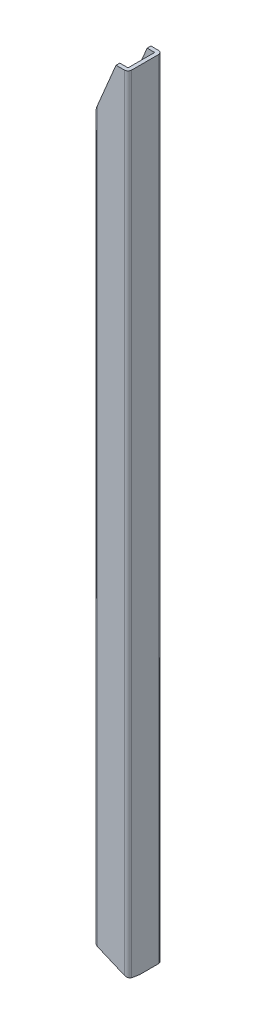
ISO-10303-21;
HEADER;
FILE_DESCRIPTION(('STEP AP214'),'2;1');
FILE_NAME('part.step','',(''),(''),'','','');
FILE_SCHEMA(('AUTOMOTIVE_DESIGN { 1 0 10303 214 1 1 1 1 }'));
ENDSEC;
DATA;
#1=APPLICATION_CONTEXT('core data for automotive mechanical design processes');
#2=APPLICATION_PROTOCOL_DEFINITION('international standard','automotive_design',2000,#1);
#3=PRODUCT_CONTEXT('',#1,'mechanical');
#4=PRODUCT('Part','Part','',(#3));
#5=PRODUCT_RELATED_PRODUCT_CATEGORY('part','',(#4));
#6=PRODUCT_DEFINITION_FORMATION('','',#4);
#7=PRODUCT_DEFINITION_CONTEXT('part definition',#1,'design');
#8=PRODUCT_DEFINITION('design','',#6,#7);
#9=PRODUCT_DEFINITION_SHAPE('','',#8);
#10=(LENGTH_UNIT() NAMED_UNIT(*) SI_UNIT(.MILLI.,.METRE.));
#11=(NAMED_UNIT(*) PLANE_ANGLE_UNIT() SI_UNIT($,.RADIAN.));
#12=(NAMED_UNIT(*) SI_UNIT($,.STERADIAN.) SOLID_ANGLE_UNIT());
#13=UNCERTAINTY_MEASURE_WITH_UNIT(LENGTH_MEASURE(1.E-05),#10,'distance_accuracy_value','');
#14=(GEOMETRIC_REPRESENTATION_CONTEXT(3) GLOBAL_UNCERTAINTY_ASSIGNED_CONTEXT((#13)) GLOBAL_UNIT_ASSIGNED_CONTEXT((#10,
#11,#12)) REPRESENTATION_CONTEXT('',''));
#15=CARTESIAN_POINT('',(0.,0.,0.));
#16=DIRECTION('',(0.,0.,1.));
#17=DIRECTION('',(1.,0.,0.));
#18=AXIS2_PLACEMENT_3D('',#15,#16,#17);
#19=CARTESIAN_POINT('',(2.80000000000002,590.8,0.));
#20=DIRECTION('',(0.,0.,1.));
#21=DIRECTION('',(1.,0.,0.));
#22=AXIS2_PLACEMENT_3D('',#19,#20,#21);
#23=PLANE('',#22);
#24=DIRECTION('',(0.92073452313586,-0.39018961788569,0.));
#25=VECTOR('',#24,1.);
#26=CARTESIAN_POINT('',(-206.971161863895,95.8007949135343,0.));
#27=LINE('',#26,#25);
#28=CARTESIAN_POINT('',(2.80000000000002,6.90380296373549,0.));
#29=VERTEX_POINT('',#28);
#30=CARTESIAN_POINT('',(19.0909760748714,0.,0.));
#31=VERTEX_POINT('',#30);
#32=EDGE_CURVE('E54',#29,#31,#27,.T.);
#33=ORIENTED_EDGE('',*,*,#32,.F.);
#34=DIRECTION('',(0.,-1.,0.));
#35=VECTOR('',#34,1.);
#36=CARTESIAN_POINT('',(2.80000000000002,590.8,0.));
#37=LINE('',#36,#35);
#38=CARTESIAN_POINT('',(2.80000000000002,556.495304558425,0.));
#39=VERTEX_POINT('',#38);
#40=EDGE_CURVE('E238',#39,#29,#37,.T.);
#41=ORIENTED_EDGE('',*,*,#40,.F.);
#42=DIRECTION('',(-0.387531836826698,-0.921856320391484,0.));
#43=VECTOR('',#42,1.);
#44=CARTESIAN_POINT('',(15.0553069286868,585.648089122031,0.));
#45=LINE('',#44,#43);
#46=CARTESIAN_POINT('',(17.2210777126401,590.8,0.));
#47=VERTEX_POINT('',#46);
#48=EDGE_CURVE('E208',#47,#39,#45,.T.);
#49=ORIENTED_EDGE('',*,*,#48,.F.);
#50=DIRECTION('',(-1.,0.,0.));
#51=VECTOR('',#50,1.);
#52=CARTESIAN_POINT('',(2.80000000000002,590.8,0.));
#53=LINE('',#52,#51);
#54=CARTESIAN_POINT('',(22.8,590.8,0.));
#55=VERTEX_POINT('',#54);
#56=EDGE_CURVE('E259',#55,#47,#53,.T.);
#57=ORIENTED_EDGE('',*,*,#56,.F.);
#58=DIRECTION('',(0.,-1.,0.));
#59=VECTOR('',#58,1.);
#60=CARTESIAN_POINT('',(22.8,590.8,0.));
#61=LINE('',#60,#59);
#62=CARTESIAN_POINT('',(22.8,0.,0.));
#63=VERTEX_POINT('',#62);
#64=EDGE_CURVE('E198',#55,#63,#61,.T.);
#65=ORIENTED_EDGE('',*,*,#64,.T.);
#66=DIRECTION('',(-1.,0.,0.));
#67=VECTOR('',#66,1.);
#68=CARTESIAN_POINT('',(2.80000000000002,0.,0.));
#69=LINE('',#68,#67);
#70=EDGE_CURVE('E41',#63,#31,#69,.T.);
#71=ORIENTED_EDGE('',*,*,#70,.T.);
#72=EDGE_LOOP('',(#33,#41,#49,#57,#65,#71));
#73=FACE_BOUND('',#72,.T.);
#74=ADVANCED_FACE('F38',(#73),#23,.F.);
#75=CARTESIAN_POINT('',(2.8,590.8,2.8));
#76=DIRECTION('',(0.,-1.,0.));
#77=DIRECTION('',(0.,0.,-1.));
#78=AXIS2_PLACEMENT_3D('',#75,#76,#77);
#79=CYLINDRICAL_SURFACE('',#78,2.8);
#80=CARTESIAN_POINT('',(2.8,7.35951557409553,2.8));
#81=DIRECTION('',(-0.385880976051716,-0.910567375927116,0.148198941354454));
#82=DIRECTION('',(0.850033983872096,-0.413360682572987,-0.326458530850899));
#83=AXIS2_PLACEMENT_3D('',#80,#81,#82);
#84=ELLIPSE('',#83,3.07500584143937,2.8);
#85=CARTESIAN_POINT('',(0.,8.54610182955487,2.80000000000002));
#86=VERTEX_POINT('',#85);
#87=EDGE_CURVE('E61',#86,#29,#84,.T.);
#88=ORIENTED_EDGE('',*,*,#87,.F.);
#89=DIRECTION('',(0.,-1.,0.));
#90=VECTOR('',#89,1.);
#91=CARTESIAN_POINT('',(0.,590.8,2.80000000000002));
#92=LINE('',#91,#90);
#93=CARTESIAN_POINT('',(0.,549.996800141644,2.80000000000002));
#94=VERTEX_POINT('',#93);
#95=EDGE_CURVE('E195',#94,#86,#92,.T.);
#96=ORIENTED_EDGE('',*,*,#95,.F.);
#97=CARTESIAN_POINT('',(2.8,556.657408256405,2.8));
#98=DIRECTION('',(-0.921624392020176,0.387434338305771,-0.0224301924871325));
#99=DIRECTION('',(-0.387319646255912,-0.921897300951451,-0.00942645864713394));
#100=AXIS2_PLACEMENT_3D('',#97,#98,#99);
#101=ELLIPSE('',#100,7.22703106865603,2.8);
#102=EDGE_CURVE('E211',#39,#94,#101,.T.);
#103=ORIENTED_EDGE('',*,*,#102,.F.);
#104=ORIENTED_EDGE('',*,*,#40,.T.);
#105=EDGE_LOOP('',(#88,#96,#103,#104));
#106=FACE_BOUND('',#105,.T.);
#107=ADVANCED_FACE('F306',(#106),#79,.T.);
#108=CARTESIAN_POINT('',(2.8,590.8,22.8));
#109=DIRECTION('',(0.,0.,1.));
#110=DIRECTION('',(1.,0.,0.));
#111=AXIS2_PLACEMENT_3D('',#108,#109,#110);
#112=PLANE('',#111);
#113=DIRECTION('',(0.92073452313586,-0.39018961788569,0.));
#114=VECTOR('',#113,1.);
#115=CARTESIAN_POINT('',(-205.63801498865,98.9466355412257,22.8));
#116=LINE('',#115,#114);
#117=CARTESIAN_POINT('',(2.8,10.6146056480961,22.8));
#118=VERTEX_POINT('',#117);
#119=CARTESIAN_POINT('',(22.8,2.13898953767221,22.8));
#120=VERTEX_POINT('',#119);
#121=EDGE_CURVE('E224',#118,#120,#116,.T.);
#122=ORIENTED_EDGE('',*,*,#121,.F.);
#123=DIRECTION('',(0.,-1.,0.));
#124=VECTOR('',#123,1.);
#125=CARTESIAN_POINT('',(2.8,590.8,22.8));
#126=LINE('',#125,#124);
#127=CARTESIAN_POINT('',(2.8,557.815291813409,22.8));
#128=VERTEX_POINT('',#127);
#129=EDGE_CURVE('E190',#128,#118,#126,.T.);
#130=ORIENTED_EDGE('',*,*,#129,.F.);
#131=DIRECTION('',(-0.387531836826698,-0.921856320391484,0.));
#132=VECTOR('',#131,1.);
#133=CARTESIAN_POINT('',(14.5837432332933,585.846326028385,22.8));
#134=LINE('',#133,#132);
#135=CARTESIAN_POINT('',(16.6661787829519,590.8,22.8));
#136=VERTEX_POINT('',#135);
#137=EDGE_CURVE('E201',#136,#128,#134,.T.);
#138=ORIENTED_EDGE('',*,*,#137,.F.);
#139=DIRECTION('',(-1.,0.,0.));
#140=VECTOR('',#139,1.);
#141=CARTESIAN_POINT('',(2.8,590.8,22.8));
#142=LINE('',#141,#140);
#143=CARTESIAN_POINT('',(22.8,590.8,22.8));
#144=VERTEX_POINT('',#143);
#145=EDGE_CURVE('E273',#144,#136,#142,.T.);
#146=ORIENTED_EDGE('',*,*,#145,.F.);
#147=DIRECTION('',(0.,-1.,0.));
#148=VECTOR('',#147,1.);
#149=CARTESIAN_POINT('',(22.8,590.8,22.8));
#150=LINE('',#149,#148);
#151=EDGE_CURVE('E197',#144,#120,#150,.T.);
#152=ORIENTED_EDGE('',*,*,#151,.T.);
#153=EDGE_LOOP('',(#122,#130,#138,#146,#152));
#154=FACE_BOUND('',#153,.T.);
#155=ADVANCED_FACE('F335',(#154),#112,.F.);
#156=CARTESIAN_POINT('',(0.,590.8,2.80000000000002));
#157=DIRECTION('',(1.,0.,0.));
#158=DIRECTION('',(0.,0.,-1.));
#159=AXIS2_PLACEMENT_3D('',#156,#157,#158);
#160=PLANE('',#159);
#161=DIRECTION('',(0.,-0.160640800332879,-0.987012934701675));
#162=VECTOR('',#161,1.);
#163=CARTESIAN_POINT('',(0.,23.5714354281297,95.1190035113739));
#164=LINE('',#163,#162);
#165=CARTESIAN_POINT('',(0.,11.8011919035556,22.8));
#166=VERTEX_POINT('',#165);
#167=EDGE_CURVE('E287',#166,#86,#164,.T.);
#168=ORIENTED_EDGE('',*,*,#167,.F.);
#169=DIRECTION('',(0.,-1.,0.));
#170=VECTOR('',#169,1.);
#171=CARTESIAN_POINT('',(0.,590.8,22.8));
#172=LINE('',#171,#170);
#173=CARTESIAN_POINT('',(0.,551.154683698648,22.8));
#174=VERTEX_POINT('',#173);
#175=EDGE_CURVE('E191',#174,#166,#172,.T.);
#176=ORIENTED_EDGE('',*,*,#175,.F.);
#177=DIRECTION('',(0.,0.0577973980724116,0.998328333153006));
#178=VECTOR('',#177,1.);
#179=CARTESIAN_POINT('',(0.,550.133104831233,5.15437646151431));
#180=LINE('',#179,#178);
#181=EDGE_CURVE('E215',#94,#174,#180,.T.);
#182=ORIENTED_EDGE('',*,*,#181,.F.);
#183=ORIENTED_EDGE('',*,*,#95,.T.);
#184=EDGE_LOOP('',(#168,#176,#182,#183));
#185=FACE_BOUND('',#184,.T.);
#186=ADVANCED_FACE('F308',(#185),#160,.F.);
#187=CARTESIAN_POINT('',(2.8,590.8,22.8));
#188=DIRECTION('',(0.,-1.,0.));
#189=DIRECTION('',(0.,0.,-1.));
#190=AXIS2_PLACEMENT_3D('',#187,#188,#189);
#191=CYLINDRICAL_SURFACE('',#190,2.8);
#192=CARTESIAN_POINT('',(2.8,10.6146056480961,22.8));
#193=DIRECTION('',(-0.385880976051716,-0.910567375927116,0.148198941354454));
#194=DIRECTION('',(0.850033983872096,-0.413360682572987,-0.326458530850899));
#195=AXIS2_PLACEMENT_3D('',#192,#193,#194);
#196=ELLIPSE('',#195,3.07500584143937,2.8);
#197=CARTESIAN_POINT('',(2.80000000000001,11.0703182584564,25.6));
#198=VERTEX_POINT('',#197);
#199=EDGE_CURVE('E290',#198,#166,#196,.T.);
#200=ORIENTED_EDGE('',*,*,#199,.F.);
#201=DIRECTION('',(0.,-1.,0.));
#202=VECTOR('',#201,1.);
#203=CARTESIAN_POINT('',(2.80000000000002,590.8,25.6));
#204=LINE('',#203,#202);
#205=CARTESIAN_POINT('',(2.80000000000001,557.977395511389,25.6));
#206=VERTEX_POINT('',#205);
#207=EDGE_CURVE('E194',#206,#198,#204,.T.);
#208=ORIENTED_EDGE('',*,*,#207,.F.);
#209=CARTESIAN_POINT('',(2.8,557.815291813409,22.8));
#210=DIRECTION('',(-0.921624392020176,0.387434338305771,-0.0224301924871325));
#211=DIRECTION('',(-0.387319646255912,-0.921897300951451,-0.00942645864713394));
#212=AXIS2_PLACEMENT_3D('',#209,#210,#211);
#213=ELLIPSE('',#212,7.22703106865603,2.8);
#214=EDGE_CURVE('E218',#174,#206,#213,.T.);
#215=ORIENTED_EDGE('',*,*,#214,.F.);
#216=ORIENTED_EDGE('',*,*,#175,.T.);
#217=EDGE_LOOP('',(#200,#208,#215,#216));
#218=FACE_BOUND('',#217,.T.);
#219=ADVANCED_FACE('F314',(#218),#191,.T.);
#220=CARTESIAN_POINT('',(2.80000000000002,590.8,25.6));
#221=DIRECTION('',(0.,0.,-1.));
#222=DIRECTION('',(-1.,0.,0.));
#223=AXIS2_PLACEMENT_3D('',#220,#221,#222);
#224=PLANE('',#223);
#225=ORIENTED_EDGE('',*,*,#207,.T.);
#226=DIRECTION('',(-0.92073452313586,0.39018961788569,0.));
#227=VECTOR('',#226,1.);
#228=CARTESIAN_POINT('',(-205.474295196954,99.3329668463809,25.6));
#229=LINE('',#228,#227);
#230=CARTESIAN_POINT('',(22.8,2.59470214803226,25.6));
#231=VERTEX_POINT('',#230);
#232=EDGE_CURVE('E223',#231,#198,#229,.T.);
#233=ORIENTED_EDGE('',*,*,#232,.F.);
#234=DIRECTION('',(0.,-1.,0.));
#235=VECTOR('',#234,1.);
#236=CARTESIAN_POINT('',(22.8,590.8,25.6));
#237=LINE('',#236,#235);
#238=CARTESIAN_POINT('',(22.8,590.8,25.6));
#239=VERTEX_POINT('',#238);
#240=EDGE_CURVE('E164',#239,#231,#237,.T.);
#241=ORIENTED_EDGE('',*,*,#240,.F.);
#242=DIRECTION('',(1.,0.,0.));
#243=VECTOR('',#242,1.);
#244=CARTESIAN_POINT('',(2.80000000000002,590.8,25.6));
#245=LINE('',#244,#243);
#246=CARTESIAN_POINT('',(16.5980333003585,590.8,25.6));
#247=VERTEX_POINT('',#246);
#248=EDGE_CURVE('E252',#247,#239,#245,.T.);
#249=ORIENTED_EDGE('',*,*,#248,.F.);
#250=DIRECTION('',(0.387531836826698,0.921856320391484,0.));
#251=VECTOR('',#250,1.);
#252=CARTESIAN_POINT('',(14.5258319022801,585.870670911621,25.6));
#253=LINE('',#252,#251);
#254=EDGE_CURVE('E182',#206,#247,#253,.T.);
#255=ORIENTED_EDGE('',*,*,#254,.F.);
#256=EDGE_LOOP('',(#225,#233,#241,#249,#255));
#257=FACE_BOUND('',#256,.T.);
#258=ADVANCED_FACE('F316',(#257),#224,.F.);
#259=CARTESIAN_POINT('',(2.8,590.8,2.8));
#260=DIRECTION('',(0.,0.,-1.));
#261=DIRECTION('',(-1.,0.,0.));
#262=AXIS2_PLACEMENT_3D('',#259,#260,#261);
#263=PLANE('',#262);
#264=DIRECTION('',(0.,-1.,0.));
#265=VECTOR('',#264,1.);
#266=CARTESIAN_POINT('',(2.8,590.8,2.8));
#267=LINE('',#266,#265);
#268=CARTESIAN_POINT('',(2.8,556.657408256405,2.8));
#269=VERTEX_POINT('',#268);
#270=CARTESIAN_POINT('',(2.8,7.35951557409555,2.8));
#271=VERTEX_POINT('',#270);
#272=EDGE_CURVE('E232',#269,#271,#267,.T.);
#273=ORIENTED_EDGE('',*,*,#272,.T.);
#274=DIRECTION('',(-0.92073452313586,0.39018961788569,0.));
#275=VECTOR('',#274,1.);
#276=CARTESIAN_POINT('',(-206.807442072198,96.1871262186893,2.79999999999996));
#277=LINE('',#276,#275);
#278=CARTESIAN_POINT('',(20.1663258887914,0.,2.8));
#279=VERTEX_POINT('',#278);
#280=EDGE_CURVE('E225',#279,#271,#277,.T.);
#281=ORIENTED_EDGE('',*,*,#280,.F.);
#282=DIRECTION('',(1.,0.,0.));
#283=VECTOR('',#282,1.);
#284=CARTESIAN_POINT('',(2.8,0.,2.8));
#285=LINE('',#284,#283);
#286=CARTESIAN_POINT('',(22.8,0.,2.8));
#287=VERTEX_POINT('',#286);
#288=EDGE_CURVE('E233',#279,#287,#285,.T.);
#289=ORIENTED_EDGE('',*,*,#288,.T.);
#290=DIRECTION('',(0.,-1.,0.));
#291=VECTOR('',#290,1.);
#292=CARTESIAN_POINT('',(22.8,590.8,2.8));
#293=LINE('',#292,#291);
#294=CARTESIAN_POINT('',(22.8,590.8,2.8));
#295=VERTEX_POINT('',#294);
#296=EDGE_CURVE('E245',#295,#287,#293,.T.);
#297=ORIENTED_EDGE('',*,*,#296,.F.);
#298=DIRECTION('',(1.,0.,0.));
#299=VECTOR('',#298,1.);
#300=CARTESIAN_POINT('',(2.8,590.8,2.8));
#301=LINE('',#300,#299);
#302=CARTESIAN_POINT('',(17.1529322300468,590.8,2.8));
#303=VERTEX_POINT('',#302);
#304=EDGE_CURVE('E263',#303,#295,#301,.T.);
#305=ORIENTED_EDGE('',*,*,#304,.F.);
#306=DIRECTION('',(0.387531836826698,0.921856320391484,0.));
#307=VECTOR('',#306,1.);
#308=CARTESIAN_POINT('',(14.9973955976736,585.672434005268,2.8));
#309=LINE('',#308,#307);
#310=EDGE_CURVE('E207',#269,#303,#309,.T.);
#311=ORIENTED_EDGE('',*,*,#310,.F.);
#312=EDGE_LOOP('',(#273,#281,#289,#297,#305,#311));
#313=FACE_BOUND('',#312,.T.);
#314=ADVANCED_FACE('F301',(#313),#263,.F.);
#315=CARTESIAN_POINT('',(2.8,590.8,2.8));
#316=DIRECTION('',(-1.,0.,0.));
#317=DIRECTION('',(0.,0.,1.));
#318=AXIS2_PLACEMENT_3D('',#315,#316,#317);
#319=PLANE('',#318);
#320=DIRECTION('',(0.,0.160640800332879,0.987012934701675));
#321=VECTOR('',#320,1.);
#322=CARTESIAN_POINT('',(2.79999999999997,22.4154695848098,95.3071421584977));
#323=LINE('',#322,#321);
#324=EDGE_CURVE('E174',#271,#118,#323,.T.);
#325=ORIENTED_EDGE('',*,*,#324,.F.);
#326=ORIENTED_EDGE('',*,*,#272,.F.);
#327=DIRECTION('',(0.,-0.0577973980724108,-0.998328333153006));
#328=VECTOR('',#327,1.);
#329=CARTESIAN_POINT('',(2.8,556.771462923332,4.77005417749728));
#330=LINE('',#329,#328);
#331=EDGE_CURVE('E203',#128,#269,#330,.T.);
#332=ORIENTED_EDGE('',*,*,#331,.F.);
#333=ORIENTED_EDGE('',*,*,#129,.T.);
#334=EDGE_LOOP('',(#325,#326,#332,#333));
#335=FACE_BOUND('',#334,.T.);
#336=ADVANCED_FACE('F297',(#335),#319,.F.);
#337=CARTESIAN_POINT('',(22.8,590.8,22.8));
#338=DIRECTION('',(0.,-1.,0.));
#339=DIRECTION('',(0.,0.,-1.));
#340=AXIS2_PLACEMENT_3D('',#337,#338,#339);
#341=CYLINDRICAL_SURFACE('',#340,2.8);
#342=CARTESIAN_POINT('',(22.8,2.13898953767222,22.8));
#343=DIRECTION('',(-0.385880976051716,-0.910567375927116,0.148198941354454));
#344=DIRECTION('',(0.850033983872096,-0.413360682572987,-0.326458530850899));
#345=AXIS2_PLACEMENT_3D('',#342,#343,#344);
#346=ELLIPSE('',#345,3.07500584143937,2.8);
#347=CARTESIAN_POINT('',(25.6,0.952403282212676,22.8));
#348=VERTEX_POINT('',#347);
#349=EDGE_CURVE('E12',#348,#231,#346,.T.);
#350=ORIENTED_EDGE('',*,*,#349,.F.);
#351=DIRECTION('',(0.,-1.,0.));
#352=VECTOR('',#351,1.);
#353=CARTESIAN_POINT('',(25.6,590.8,22.8));
#354=LINE('',#353,#352);
#355=CARTESIAN_POINT('',(25.6,590.8,22.8));
#356=VERTEX_POINT('',#355);
#357=EDGE_CURVE('E173',#356,#348,#354,.T.);
#358=ORIENTED_EDGE('',*,*,#357,.F.);
#359=CARTESIAN_POINT('',(22.8,590.8,22.8));
#360=DIRECTION('',(0.,1.,0.));
#361=DIRECTION('',(0.,0.,1.));
#362=AXIS2_PLACEMENT_3D('',#359,#360,#361);
#363=CIRCLE('',#362,2.8);
#364=EDGE_CURVE('E265',#239,#356,#363,.T.);
#365=ORIENTED_EDGE('',*,*,#364,.F.);
#366=ORIENTED_EDGE('',*,*,#240,.T.);
#367=EDGE_LOOP('',(#350,#358,#365,#366));
#368=FACE_BOUND('',#367,.T.);
#369=ADVANCED_FACE('F320',(#368),#341,.T.);
#370=CARTESIAN_POINT('',(22.8,0.,2.8));
#371=DIRECTION('',(0.,-1.,0.));
#372=DIRECTION('',(0.,0.,-1.));
#373=AXIS2_PLACEMENT_3D('',#370,#371,#372);
#374=PLANE('',#373);
#375=DIRECTION('',(0.,0.,-1.));
#376=VECTOR('',#375,1.);
#377=CARTESIAN_POINT('',(25.6,0.,2.80000000000002));
#378=LINE('',#377,#376);
#379=CARTESIAN_POINT('',(25.6,0.,16.9482216432654));
#380=VERTEX_POINT('',#379);
#381=CARTESIAN_POINT('',(25.6,0.,2.80000000000002));
#382=VERTEX_POINT('',#381);
#383=EDGE_CURVE('E169',#380,#382,#378,.T.);
#384=ORIENTED_EDGE('',*,*,#383,.F.);
#385=DIRECTION('',(-0.358522103340796,0.,-0.933521237795955));
#386=VECTOR('',#385,1.);
#387=CARTESIAN_POINT('',(20.5048533513358,0.,3.68145911484288));
#388=LINE('',#387,#386);
#389=CARTESIAN_POINT('',(22.8,0.,9.65757082572313));
#390=VERTEX_POINT('',#389);
#391=EDGE_CURVE('E153',#380,#390,#388,.T.);
#392=ORIENTED_EDGE('',*,*,#391,.T.);
#393=DIRECTION('',(0.,0.,1.));
#394=VECTOR('',#393,1.);
#395=CARTESIAN_POINT('',(22.8,0.,2.8));
#396=LINE('',#395,#394);
#397=EDGE_CURVE('E247',#287,#390,#396,.T.);
#398=ORIENTED_EDGE('',*,*,#397,.F.);
#399=ORIENTED_EDGE('',*,*,#288,.F.);
#400=EDGE_CURVE('E163',#279,#31,#388,.T.);
#401=ORIENTED_EDGE('',*,*,#400,.T.);
#402=ORIENTED_EDGE('',*,*,#70,.F.);
#403=CARTESIAN_POINT('',(22.8,0.,2.8));
#404=DIRECTION('',(0.,1.,0.));
#405=DIRECTION('',(0.,0.,-1.));
#406=AXIS2_PLACEMENT_3D('',#403,#404,#405);
#407=CIRCLE('',#406,2.8);
#408=EDGE_CURVE('E179',#382,#63,#407,.T.);
#409=ORIENTED_EDGE('',*,*,#408,.F.);
#410=EDGE_LOOP('',(#384,#392,#398,#399,#401,#402,#409));
#411=FACE_BOUND('',#410,.T.);
#412=ADVANCED_FACE('F177',(#411),#374,.T.);
#413=CARTESIAN_POINT('',(25.6,590.8,2.80000000000002));
#414=DIRECTION('',(-1.,0.,0.));
#415=DIRECTION('',(0.,0.,1.));
#416=AXIS2_PLACEMENT_3D('',#413,#414,#415);
#417=PLANE('',#416);
#418=DIRECTION('',(0.,0.160640800332879,0.987012934701675));
#419=VECTOR('',#418,1.);
#420=CARTESIAN_POINT('',(25.6,13.002604860633,96.8391282850765));
#421=LINE('',#420,#419);
#422=EDGE_CURVE('E156',#380,#348,#421,.T.);
#423=ORIENTED_EDGE('',*,*,#422,.F.);
#424=ORIENTED_EDGE('',*,*,#383,.T.);
#425=DIRECTION('',(0.,-1.,0.));
#426=VECTOR('',#425,1.);
#427=CARTESIAN_POINT('',(25.6,590.8,2.80000000000002));
#428=LINE('',#427,#426);
#429=CARTESIAN_POINT('',(25.6,590.8,2.80000000000002));
#430=VERTEX_POINT('',#429);
#431=EDGE_CURVE('E180',#430,#382,#428,.T.);
#432=ORIENTED_EDGE('',*,*,#431,.F.);
#433=DIRECTION('',(0.,0.,-1.));
#434=VECTOR('',#433,1.);
#435=CARTESIAN_POINT('',(25.6,590.8,2.80000000000002));
#436=LINE('',#435,#434);
#437=EDGE_CURVE('E260',#356,#430,#436,.T.);
#438=ORIENTED_EDGE('',*,*,#437,.F.);
#439=ORIENTED_EDGE('',*,*,#357,.T.);
#440=EDGE_LOOP('',(#423,#424,#432,#438,#439));
#441=FACE_BOUND('',#440,.T.);
#442=ADVANCED_FACE('F167',(#441),#417,.F.);
#443=CARTESIAN_POINT('',(22.8,590.8,2.8));
#444=DIRECTION('',(1.,0.,0.));
#445=DIRECTION('',(0.,0.,-1.));
#446=AXIS2_PLACEMENT_3D('',#443,#444,#445);
#447=PLANE('',#446);
#448=DIRECTION('',(0.,-0.160640800332879,-0.987012934701675));
#449=VECTOR('',#448,1.);
#450=CARTESIAN_POINT('',(22.8,14.1585707039531,96.6509896379528));
#451=LINE('',#450,#449);
#452=EDGE_CURVE('E46',#120,#390,#451,.T.);
#453=ORIENTED_EDGE('',*,*,#452,.F.);
#454=ORIENTED_EDGE('',*,*,#151,.F.);
#455=DIRECTION('',(0.,0.,1.));
#456=VECTOR('',#455,1.);
#457=CARTESIAN_POINT('',(22.8,590.8,2.8));
#458=LINE('',#457,#456);
#459=EDGE_CURVE('E275',#295,#144,#458,.T.);
#460=ORIENTED_EDGE('',*,*,#459,.F.);
#461=ORIENTED_EDGE('',*,*,#296,.T.);
#462=ORIENTED_EDGE('',*,*,#397,.T.);
#463=EDGE_LOOP('',(#453,#454,#460,#461,#462));
#464=FACE_BOUND('',#463,.T.);
#465=ADVANCED_FACE('F391',(#464),#447,.F.);
#466=CARTESIAN_POINT('',(22.8,590.8,2.8));
#467=DIRECTION('',(0.,-1.,0.));
#468=DIRECTION('',(0.,0.,-1.));
#469=AXIS2_PLACEMENT_3D('',#466,#467,#468);
#470=PLANE('',#469);
#471=DIRECTION('',(0.024330467682228,0.,-0.999703970354407));
#472=VECTOR('',#471,1.);
#473=CARTESIAN_POINT('',(17.1562751341155,590.8,2.66264487335375));
#474=LINE('',#473,#472);
#475=EDGE_CURVE('E204',#247,#136,#474,.T.);
#476=ORIENTED_EDGE('',*,*,#475,.F.);
#477=ORIENTED_EDGE('',*,*,#248,.T.);
#478=ORIENTED_EDGE('',*,*,#364,.T.);
#479=ORIENTED_EDGE('',*,*,#437,.T.);
#480=CARTESIAN_POINT('',(22.8,590.8,2.8));
#481=DIRECTION('',(0.,1.,0.));
#482=DIRECTION('',(0.,0.,-1.));
#483=AXIS2_PLACEMENT_3D('',#480,#481,#482);
#484=CIRCLE('',#483,2.8);
#485=EDGE_CURVE('E256',#430,#55,#484,.T.);
#486=ORIENTED_EDGE('',*,*,#485,.T.);
#487=ORIENTED_EDGE('',*,*,#56,.T.);
#488=DIRECTION('',(0.024330467682228,0.,-0.999703970354407));
#489=VECTOR('',#488,1.);
#490=CARTESIAN_POINT('',(17.1562751341154,590.8,2.66264487335375));
#491=LINE('',#490,#489);
#492=EDGE_CURVE('E212',#303,#47,#491,.T.);
#493=ORIENTED_EDGE('',*,*,#492,.F.);
#494=ORIENTED_EDGE('',*,*,#304,.T.);
#495=ORIENTED_EDGE('',*,*,#459,.T.);
#496=ORIENTED_EDGE('',*,*,#145,.T.);
#497=EDGE_LOOP('',(#476,#477,#478,#479,#486,#487,#493,#494,#495,#496));
#498=FACE_BOUND('',#497,.T.);
#499=ADVANCED_FACE('F268',(#498),#470,.F.);
#500=CARTESIAN_POINT('',(22.8,590.8,2.8));
#501=DIRECTION('',(0.,-1.,0.));
#502=DIRECTION('',(0.,0.,-1.));
#503=AXIS2_PLACEMENT_3D('',#500,#501,#502);
#504=CYLINDRICAL_SURFACE('',#503,2.8);
#505=ORIENTED_EDGE('',*,*,#408,.T.);
#506=ORIENTED_EDGE('',*,*,#64,.F.);
#507=ORIENTED_EDGE('',*,*,#485,.F.);
#508=ORIENTED_EDGE('',*,*,#431,.T.);
#509=EDGE_LOOP('',(#505,#506,#507,#508));
#510=FACE_BOUND('',#509,.T.);
#511=ADVANCED_FACE('F272',(#510),#504,.T.);
#512=CARTESIAN_POINT('',(16.7949559169401,591.099113286748,22.6752846418945));
#513=DIRECTION('',(-0.921624392020176,0.387434338305771,-0.0224301924871325));
#514=DIRECTION('',(0.0370186551541332,0.145299237962743,0.988694973496895));
#515=AXIS2_PLACEMENT_3D('',#512,#513,#514);
#516=PLANE('',#515);
#517=ORIENTED_EDGE('',*,*,#254,.T.);
#518=ORIENTED_EDGE('',*,*,#475,.T.);
#519=ORIENTED_EDGE('',*,*,#137,.T.);
#520=ORIENTED_EDGE('',*,*,#331,.T.);
#521=ORIENTED_EDGE('',*,*,#310,.T.);
#522=ORIENTED_EDGE('',*,*,#492,.T.);
#523=ORIENTED_EDGE('',*,*,#48,.T.);
#524=ORIENTED_EDGE('',*,*,#102,.T.);
#525=ORIENTED_EDGE('',*,*,#181,.T.);
#526=ORIENTED_EDGE('',*,*,#214,.T.);
#527=EDGE_LOOP('',(#517,#518,#519,#520,#521,#522,#523,#524,#525,#526));
#528=FACE_BOUND('',#527,.T.);
#529=ADVANCED_FACE('F305',(#528),#516,.T.);
#530=CARTESIAN_POINT('',(22.3598498422431,-2.8861404933107,-9.22158527663869));
#531=DIRECTION('',(-0.385880976051716,-0.910567375927116,0.148198941354454));
#532=DIRECTION('',(-0.921803402101503,0.387017180961267,-0.0222753117798169));
#533=AXIS2_PLACEMENT_3D('',#530,#531,#532);
#534=PLANE('',#533);
#535=ORIENTED_EDGE('',*,*,#32,.T.);
#536=ORIENTED_EDGE('',*,*,#400,.F.);
#537=ORIENTED_EDGE('',*,*,#280,.T.);
#538=ORIENTED_EDGE('',*,*,#324,.T.);
#539=ORIENTED_EDGE('',*,*,#121,.T.);
#540=ORIENTED_EDGE('',*,*,#452,.T.);
#541=ORIENTED_EDGE('',*,*,#391,.F.);
#542=ORIENTED_EDGE('',*,*,#422,.T.);
#543=ORIENTED_EDGE('',*,*,#349,.T.);
#544=ORIENTED_EDGE('',*,*,#232,.T.);
#545=ORIENTED_EDGE('',*,*,#199,.T.);
#546=ORIENTED_EDGE('',*,*,#167,.T.);
#547=ORIENTED_EDGE('',*,*,#87,.T.);
#548=EDGE_LOOP('',(#535,#536,#537,#538,#539,#540,#541,#542,#543,#544,#545,#546,#547));
#549=FACE_BOUND('',#548,.T.);
#550=ADVANCED_FACE('F155',(#549),#534,.T.);
#551=CLOSED_SHELL('',(#74,#107,#155,#186,#219,#258,#314,#336,#369,#412,#442,#465,#499,#511,#529,#550));
#552=MANIFOLD_SOLID_BREP('B2',#551);
#553=ADVANCED_BREP_SHAPE_REPRESENTATION('',(#18,#552),#14);
#554=SHAPE_DEFINITION_REPRESENTATION(#9,#553);
ENDSEC;
END-ISO-10303-21;
